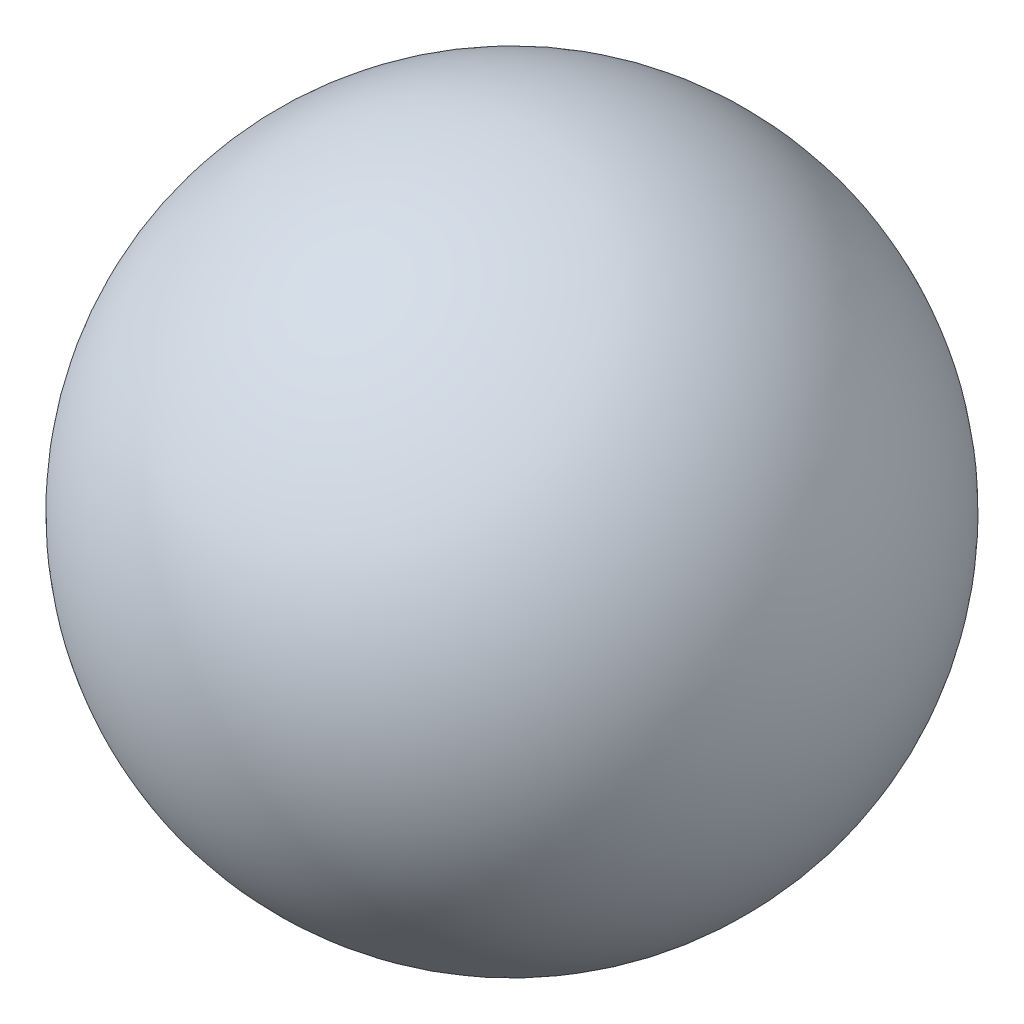
ISO-10303-21;
HEADER;
FILE_DESCRIPTION(('STEP AP214'),'2;1');
FILE_NAME('part.step','',(''),(''),'','','');
FILE_SCHEMA(('AUTOMOTIVE_DESIGN { 1 0 10303 214 1 1 1 1 }'));
ENDSEC;
DATA;
#1=APPLICATION_CONTEXT('core data for automotive mechanical design processes');
#2=APPLICATION_PROTOCOL_DEFINITION('international standard','automotive_design',2000,#1);
#3=PRODUCT_CONTEXT('',#1,'mechanical');
#4=PRODUCT('Part','Part','',(#3));
#5=PRODUCT_RELATED_PRODUCT_CATEGORY('part','',(#4));
#6=PRODUCT_DEFINITION_FORMATION('','',#4);
#7=PRODUCT_DEFINITION_CONTEXT('part definition',#1,'design');
#8=PRODUCT_DEFINITION('design','',#6,#7);
#9=PRODUCT_DEFINITION_SHAPE('','',#8);
#10=(LENGTH_UNIT() NAMED_UNIT(*) SI_UNIT(.MILLI.,.METRE.));
#11=(NAMED_UNIT(*) PLANE_ANGLE_UNIT() SI_UNIT($,.RADIAN.));
#12=(NAMED_UNIT(*) SI_UNIT($,.STERADIAN.) SOLID_ANGLE_UNIT());
#13=UNCERTAINTY_MEASURE_WITH_UNIT(LENGTH_MEASURE(1.E-05),#10,'distance_accuracy_value','');
#14=(GEOMETRIC_REPRESENTATION_CONTEXT(3) GLOBAL_UNCERTAINTY_ASSIGNED_CONTEXT((#13)) GLOBAL_UNIT_ASSIGNED_CONTEXT((#10,
#11,#12)) REPRESENTATION_CONTEXT('',''));
#15=CARTESIAN_POINT('',(0.,0.,0.));
#16=DIRECTION('',(0.,0.,1.));
#17=DIRECTION('',(1.,0.,0.));
#18=AXIS2_PLACEMENT_3D('',#15,#16,#17);
#19=CARTESIAN_POINT('',(0.,0.,0.));
#20=DIRECTION('',(0.,0.,-1.));
#21=DIRECTION('',(1.,0.,0.));
#22=AXIS2_PLACEMENT_3D('',#19,#20,#21);
#23=SPHERICAL_SURFACE('',#22,21.41);
#24=CARTESIAN_POINT('',(0.,0.,-21.41));
#25=VERTEX_POINT('',#24);
#26=VERTEX_LOOP('',#25);
#27=FACE_BOUND('',#26,.T.);
#28=ADVANCED_FACE('F30',(#27),#23,.T.);
#29=CLOSED_SHELL('',(#28));
#30=MANIFOLD_SOLID_BREP('B2',#29);
#31=ADVANCED_BREP_SHAPE_REPRESENTATION('',(#18,#30),#14);
#32=SHAPE_DEFINITION_REPRESENTATION(#9,#31);
ENDSEC;
END-ISO-10303-21;
